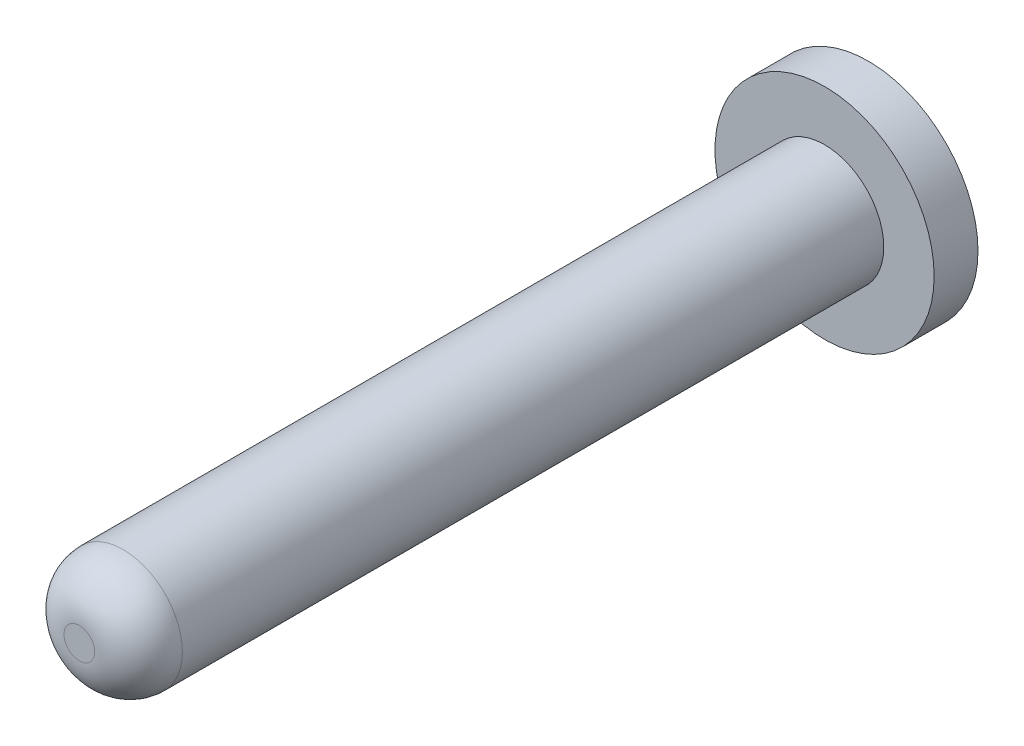
ISO-10303-21;
HEADER;
FILE_DESCRIPTION(('STEP AP214'),'2;1');
FILE_NAME('part.step','',(''),(''),'','','');
FILE_SCHEMA(('AUTOMOTIVE_DESIGN { 1 0 10303 214 1 1 1 1 }'));
ENDSEC;
DATA;
#1=APPLICATION_CONTEXT('core data for automotive mechanical design processes');
#2=APPLICATION_PROTOCOL_DEFINITION('international standard','automotive_design',2000,#1);
#3=PRODUCT_CONTEXT('',#1,'mechanical');
#4=PRODUCT('Part','Part','',(#3));
#5=PRODUCT_RELATED_PRODUCT_CATEGORY('part','',(#4));
#6=PRODUCT_DEFINITION_FORMATION('','',#4);
#7=PRODUCT_DEFINITION_CONTEXT('part definition',#1,'design');
#8=PRODUCT_DEFINITION('design','',#6,#7);
#9=PRODUCT_DEFINITION_SHAPE('','',#8);
#10=(LENGTH_UNIT() NAMED_UNIT(*) SI_UNIT(.MILLI.,.METRE.));
#11=(NAMED_UNIT(*) PLANE_ANGLE_UNIT() SI_UNIT($,.RADIAN.));
#12=(NAMED_UNIT(*) SI_UNIT($,.STERADIAN.) SOLID_ANGLE_UNIT());
#13=UNCERTAINTY_MEASURE_WITH_UNIT(LENGTH_MEASURE(1.E-05),#10,'distance_accuracy_value','');
#14=(GEOMETRIC_REPRESENTATION_CONTEXT(3) GLOBAL_UNCERTAINTY_ASSIGNED_CONTEXT((#13)) GLOBAL_UNIT_ASSIGNED_CONTEXT((#10,
#11,#12)) REPRESENTATION_CONTEXT('',''));
#15=CARTESIAN_POINT('',(0.,0.,0.));
#16=DIRECTION('',(0.,0.,1.));
#17=DIRECTION('',(1.,0.,0.));
#18=AXIS2_PLACEMENT_3D('',#15,#16,#17);
#19=CARTESIAN_POINT('',(0.,0.,1.));
#20=DIRECTION('',(0.,0.,-1.));
#21=DIRECTION('',(-1.,0.,0.));
#22=AXIS2_PLACEMENT_3D('',#19,#20,#21);
#23=CYLINDRICAL_SURFACE('',#22,2.5);
#24=CARTESIAN_POINT('',(0.,0.,1.));
#25=DIRECTION('',(0.,0.,1.));
#26=DIRECTION('',(1.,0.,0.));
#27=AXIS2_PLACEMENT_3D('',#24,#25,#26);
#28=CIRCLE('',#27,2.5);
#29=CARTESIAN_POINT('',(2.5,0.,1.));
#30=VERTEX_POINT('',#29);
#31=EDGE_CURVE('E54',#30,#30,#28,.T.);
#32=ORIENTED_EDGE('',*,*,#31,.F.);
#33=EDGE_LOOP('',(#32));
#34=FACE_BOUND('',#33,.T.);
#35=CARTESIAN_POINT('',(0.,0.,0.));
#36=DIRECTION('',(0.,0.,1.));
#37=DIRECTION('',(1.,0.,0.));
#38=AXIS2_PLACEMENT_3D('',#35,#36,#37);
#39=CIRCLE('',#38,2.5);
#40=CARTESIAN_POINT('',(2.5,0.,0.));
#41=VERTEX_POINT('',#40);
#42=EDGE_CURVE('E57',#41,#41,#39,.T.);
#43=ORIENTED_EDGE('',*,*,#42,.T.);
#44=EDGE_LOOP('',(#43));
#45=FACE_BOUND('',#44,.T.);
#46=ADVANCED_FACE('F39',(#34,#45),#23,.T.);
#47=CARTESIAN_POINT('',(0.,0.,1.));
#48=DIRECTION('',(0.,0.,1.));
#49=DIRECTION('',(1.,0.,0.));
#50=AXIS2_PLACEMENT_3D('',#47,#48,#49);
#51=PLANE('',#50);
#52=CARTESIAN_POINT('',(0.,0.,1.));
#53=DIRECTION('',(0.,0.,1.));
#54=DIRECTION('',(1.,0.,0.));
#55=AXIS2_PLACEMENT_3D('',#52,#53,#54);
#56=CIRCLE('',#55,1.35);
#57=CARTESIAN_POINT('',(1.35,0.,1.));
#58=VERTEX_POINT('',#57);
#59=EDGE_CURVE('E50',#58,#58,#56,.T.);
#60=ORIENTED_EDGE('',*,*,#59,.F.);
#61=EDGE_LOOP('',(#60));
#62=FACE_BOUND('',#61,.T.);
#63=ORIENTED_EDGE('',*,*,#31,.T.);
#64=EDGE_LOOP('',(#63));
#65=FACE_BOUND('',#64,.T.);
#66=ADVANCED_FACE('F63',(#62,#65),#51,.T.);
#67=CARTESIAN_POINT('',(0.,0.,0.));
#68=DIRECTION('',(0.,0.,1.));
#69=DIRECTION('',(1.,0.,0.));
#70=AXIS2_PLACEMENT_3D('',#67,#68,#69);
#71=PLANE('',#70);
#72=ORIENTED_EDGE('',*,*,#42,.F.);
#73=EDGE_LOOP('',(#72));
#74=FACE_BOUND('',#73,.T.);
#75=ADVANCED_FACE('F69',(#74),#71,.F.);
#76=CARTESIAN_POINT('',(0.,0.,18.));
#77=DIRECTION('',(0.,0.,-1.));
#78=DIRECTION('',(-1.,0.,0.));
#79=AXIS2_PLACEMENT_3D('',#76,#77,#78);
#80=CYLINDRICAL_SURFACE('',#79,1.35);
#81=CARTESIAN_POINT('',(0.,0.,17.));
#82=DIRECTION('',(0.,0.,1.));
#83=DIRECTION('',(1.,0.,0.));
#84=AXIS2_PLACEMENT_3D('',#81,#82,#83);
#85=CIRCLE('',#84,1.35);
#86=CARTESIAN_POINT('',(1.35,0.,17.));
#87=VERTEX_POINT('',#86);
#88=EDGE_CURVE('E10',#87,#87,#85,.F.);
#89=ORIENTED_EDGE('',*,*,#88,.T.);
#90=EDGE_LOOP('',(#89));
#91=FACE_BOUND('',#90,.T.);
#92=ORIENTED_EDGE('',*,*,#59,.T.);
#93=EDGE_LOOP('',(#92));
#94=FACE_BOUND('',#93,.T.);
#95=ADVANCED_FACE('F71',(#91,#94),#80,.T.);
#96=CARTESIAN_POINT('',(0.,0.,18.));
#97=DIRECTION('',(0.,0.,1.));
#98=DIRECTION('',(1.,0.,0.));
#99=AXIS2_PLACEMENT_3D('',#96,#97,#98);
#100=PLANE('',#99);
#101=CARTESIAN_POINT('',(0.,0.,18.));
#102=DIRECTION('',(0.,0.,1.));
#103=DIRECTION('',(1.,0.,0.));
#104=AXIS2_PLACEMENT_3D('',#101,#102,#103);
#105=CIRCLE('',#104,0.35);
#106=CARTESIAN_POINT('',(0.35,0.,18.));
#107=VERTEX_POINT('',#106);
#108=EDGE_CURVE('E46',#107,#107,#105,.T.);
#109=ORIENTED_EDGE('',*,*,#108,.T.);
#110=EDGE_LOOP('',(#109));
#111=FACE_BOUND('',#110,.T.);
#112=ADVANCED_FACE('F77',(#111),#100,.T.);
#113=CARTESIAN_POINT('',(0.,0.,17.));
#114=DIRECTION('',(0.,0.,1.));
#115=DIRECTION('',(1.,0.,0.));
#116=AXIS2_PLACEMENT_3D('',#113,#114,#115);
#117=DEGENERATE_TOROIDAL_SURFACE('',#116,0.35,1.,.T.);
#118=ORIENTED_EDGE('',*,*,#88,.F.);
#119=EDGE_LOOP('',(#118));
#120=FACE_BOUND('',#119,.T.);
#121=ORIENTED_EDGE('',*,*,#108,.F.);
#122=EDGE_LOOP('',(#121));
#123=FACE_BOUND('',#122,.T.);
#124=ADVANCED_FACE('F41',(#120,#123),#117,.T.);
#125=CLOSED_SHELL('',(#46,#66,#75,#95,#112,#124));
#126=MANIFOLD_SOLID_BREP('B2',#125);
#127=ADVANCED_BREP_SHAPE_REPRESENTATION('',(#18,#126),#14);
#128=SHAPE_DEFINITION_REPRESENTATION(#9,#127);
ENDSEC;
END-ISO-10303-21;
